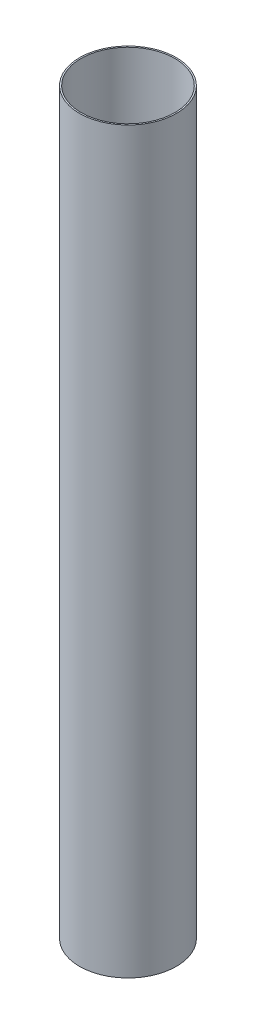
ISO-10303-21;
HEADER;
FILE_DESCRIPTION(('STEP AP214'),'2;1');
FILE_NAME('part.step','',(''),(''),'','','');
FILE_SCHEMA(('AUTOMOTIVE_DESIGN { 1 0 10303 214 1 1 1 1 }'));
ENDSEC;
DATA;
#1=APPLICATION_CONTEXT('core data for automotive mechanical design processes');
#2=APPLICATION_PROTOCOL_DEFINITION('international standard','automotive_design',2000,#1);
#3=PRODUCT_CONTEXT('',#1,'mechanical');
#4=PRODUCT('Part','Part','',(#3));
#5=PRODUCT_RELATED_PRODUCT_CATEGORY('part','',(#4));
#6=PRODUCT_DEFINITION_FORMATION('','',#4);
#7=PRODUCT_DEFINITION_CONTEXT('part definition',#1,'design');
#8=PRODUCT_DEFINITION('design','',#6,#7);
#9=PRODUCT_DEFINITION_SHAPE('','',#8);
#10=(LENGTH_UNIT() NAMED_UNIT(*) SI_UNIT(.MILLI.,.METRE.));
#11=(NAMED_UNIT(*) PLANE_ANGLE_UNIT() SI_UNIT($,.RADIAN.));
#12=(NAMED_UNIT(*) SI_UNIT($,.STERADIAN.) SOLID_ANGLE_UNIT());
#13=UNCERTAINTY_MEASURE_WITH_UNIT(LENGTH_MEASURE(1.E-05),#10,'distance_accuracy_value','');
#14=(GEOMETRIC_REPRESENTATION_CONTEXT(3) GLOBAL_UNCERTAINTY_ASSIGNED_CONTEXT((#13)) GLOBAL_UNIT_ASSIGNED_CONTEXT((#10,
#11,#12)) REPRESENTATION_CONTEXT('',''));
#15=CARTESIAN_POINT('',(0.,0.,0.));
#16=DIRECTION('',(0.,0.,1.));
#17=DIRECTION('',(1.,0.,0.));
#18=AXIS2_PLACEMENT_3D('',#15,#16,#17);
#19=CARTESIAN_POINT('',(0.,290.,0.));
#20=DIRECTION('',(0.,1.,0.));
#21=DIRECTION('',(0.,0.,1.));
#22=AXIS2_PLACEMENT_3D('',#19,#20,#21);
#23=PLANE('',#22);
#24=CARTESIAN_POINT('',(0.,290.,0.));
#25=DIRECTION('',(0.,1.,0.));
#26=DIRECTION('',(0.,0.,1.));
#27=AXIS2_PLACEMENT_3D('',#24,#25,#26);
#28=CIRCLE('',#27,19.);
#29=CARTESIAN_POINT('',(0.,290.,19.));
#30=VERTEX_POINT('',#29);
#31=EDGE_CURVE('E10',#30,#30,#28,.T.);
#32=ORIENTED_EDGE('',*,*,#31,.T.);
#33=EDGE_LOOP('',(#32));
#34=FACE_BOUND('',#33,.T.);
#35=CARTESIAN_POINT('',(0.,290.,0.));
#36=DIRECTION('',(0.,1.,0.));
#37=DIRECTION('',(0.,0.,1.));
#38=AXIS2_PLACEMENT_3D('',#35,#36,#37);
#39=CIRCLE('',#38,18.42);
#40=CARTESIAN_POINT('',(0.,290.,18.42));
#41=VERTEX_POINT('',#40);
#42=EDGE_CURVE('E44',#41,#41,#39,.T.);
#43=ORIENTED_EDGE('',*,*,#42,.F.);
#44=EDGE_LOOP('',(#43));
#45=FACE_BOUND('',#44,.T.);
#46=ADVANCED_FACE('F33',(#34,#45),#23,.T.);
#47=CARTESIAN_POINT('',(0.,0.,0.));
#48=DIRECTION('',(0.,1.,0.));
#49=DIRECTION('',(0.,0.,1.));
#50=AXIS2_PLACEMENT_3D('',#47,#48,#49);
#51=PLANE('',#50);
#52=CARTESIAN_POINT('',(0.,0.,0.));
#53=DIRECTION('',(0.,1.,0.));
#54=DIRECTION('',(0.,0.,1.));
#55=AXIS2_PLACEMENT_3D('',#52,#53,#54);
#56=CIRCLE('',#55,19.);
#57=CARTESIAN_POINT('',(0.,0.,19.));
#58=VERTEX_POINT('',#57);
#59=EDGE_CURVE('E37',#58,#58,#56,.T.);
#60=ORIENTED_EDGE('',*,*,#59,.F.);
#61=EDGE_LOOP('',(#60));
#62=FACE_BOUND('',#61,.T.);
#63=CARTESIAN_POINT('',(0.,0.,0.));
#64=DIRECTION('',(0.,1.,0.));
#65=DIRECTION('',(0.,0.,1.));
#66=AXIS2_PLACEMENT_3D('',#63,#64,#65);
#67=CIRCLE('',#66,18.42);
#68=CARTESIAN_POINT('',(0.,0.,18.42));
#69=VERTEX_POINT('',#68);
#70=EDGE_CURVE('E46',#69,#69,#67,.T.);
#71=ORIENTED_EDGE('',*,*,#70,.T.);
#72=EDGE_LOOP('',(#71));
#73=FACE_BOUND('',#72,.T.);
#74=ADVANCED_FACE('F56',(#62,#73),#51,.F.);
#75=CARTESIAN_POINT('',(0.,290.,0.));
#76=DIRECTION('',(0.,-1.,0.));
#77=DIRECTION('',(0.,0.,-1.));
#78=AXIS2_PLACEMENT_3D('',#75,#76,#77);
#79=CYLINDRICAL_SURFACE('',#78,19.);
#80=ORIENTED_EDGE('',*,*,#31,.F.);
#81=EDGE_LOOP('',(#80));
#82=FACE_BOUND('',#81,.T.);
#83=ORIENTED_EDGE('',*,*,#59,.T.);
#84=EDGE_LOOP('',(#83));
#85=FACE_BOUND('',#84,.T.);
#86=ADVANCED_FACE('F35',(#82,#85),#79,.T.);
#87=CARTESIAN_POINT('',(0.,290.,0.));
#88=DIRECTION('',(0.,-1.,0.));
#89=DIRECTION('',(0.,0.,-1.));
#90=AXIS2_PLACEMENT_3D('',#87,#88,#89);
#91=CYLINDRICAL_SURFACE('',#90,18.42);
#92=ORIENTED_EDGE('',*,*,#42,.T.);
#93=EDGE_LOOP('',(#92));
#94=FACE_BOUND('',#93,.T.);
#95=ORIENTED_EDGE('',*,*,#70,.F.);
#96=EDGE_LOOP('',(#95));
#97=FACE_BOUND('',#96,.T.);
#98=ADVANCED_FACE('F52',(#94,#97),#91,.F.);
#99=CLOSED_SHELL('',(#46,#74,#86,#98));
#100=MANIFOLD_SOLID_BREP('B2',#99);
#101=ADVANCED_BREP_SHAPE_REPRESENTATION('',(#18,#100),#14);
#102=SHAPE_DEFINITION_REPRESENTATION(#9,#101);
ENDSEC;
END-ISO-10303-21;
